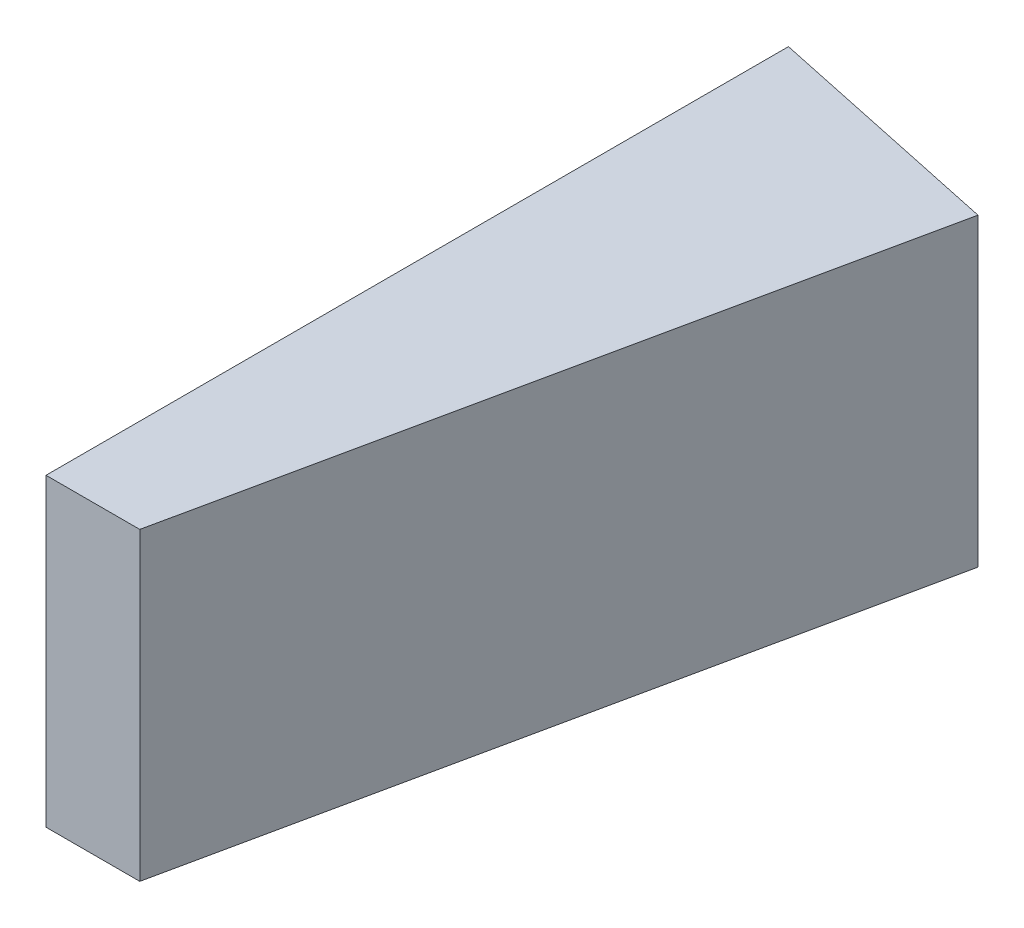
ISO-10303-21;
HEADER;
FILE_DESCRIPTION(('STEP AP214'),'2;1');
FILE_NAME('part.step','',(''),(''),'','','');
FILE_SCHEMA(('AUTOMOTIVE_DESIGN { 1 0 10303 214 1 1 1 1 }'));
ENDSEC;
DATA;
#1=APPLICATION_CONTEXT('core data for automotive mechanical design processes');
#2=APPLICATION_PROTOCOL_DEFINITION('international standard','automotive_design',2000,#1);
#3=PRODUCT_CONTEXT('',#1,'mechanical');
#4=PRODUCT('Part','Part','',(#3));
#5=PRODUCT_RELATED_PRODUCT_CATEGORY('part','',(#4));
#6=PRODUCT_DEFINITION_FORMATION('','',#4);
#7=PRODUCT_DEFINITION_CONTEXT('part definition',#1,'design');
#8=PRODUCT_DEFINITION('design','',#6,#7);
#9=PRODUCT_DEFINITION_SHAPE('','',#8);
#10=(LENGTH_UNIT() NAMED_UNIT(*) SI_UNIT(.MILLI.,.METRE.));
#11=(NAMED_UNIT(*) PLANE_ANGLE_UNIT() SI_UNIT($,.RADIAN.));
#12=(NAMED_UNIT(*) SI_UNIT($,.STERADIAN.) SOLID_ANGLE_UNIT());
#13=UNCERTAINTY_MEASURE_WITH_UNIT(LENGTH_MEASURE(1.E-05),#10,'distance_accuracy_value','');
#14=(GEOMETRIC_REPRESENTATION_CONTEXT(3) GLOBAL_UNCERTAINTY_ASSIGNED_CONTEXT((#13)) GLOBAL_UNIT_ASSIGNED_CONTEXT((#10,
#11,#12)) REPRESENTATION_CONTEXT('',''));
#15=CARTESIAN_POINT('',(0.,0.,0.));
#16=DIRECTION('',(0.,0.,1.));
#17=DIRECTION('',(1.,0.,0.));
#18=AXIS2_PLACEMENT_3D('',#15,#16,#17);
#19=CARTESIAN_POINT('',(0.,10.,0.));
#20=DIRECTION('',(0.,0.,-1.));
#21=DIRECTION('',(-1.,0.,0.));
#22=AXIS2_PLACEMENT_3D('',#19,#20,#21);
#23=PLANE('',#22);
#24=DIRECTION('',(1.,0.,0.));
#25=VECTOR('',#24,1.);
#26=CARTESIAN_POINT('',(0.,0.,0.));
#27=LINE('',#26,#25);
#28=CARTESIAN_POINT('',(0.,0.,0.));
#29=VERTEX_POINT('',#28);
#30=CARTESIAN_POINT('',(3.07711384910708,0.,0.));
#31=VERTEX_POINT('',#30);
#32=EDGE_CURVE('E96',#29,#31,#27,.T.);
#33=ORIENTED_EDGE('',*,*,#32,.T.);
#34=DIRECTION('',(0.,-1.,0.));
#35=VECTOR('',#34,1.);
#36=CARTESIAN_POINT('',(3.07711384910708,10.,0.));
#37=LINE('',#36,#35);
#38=CARTESIAN_POINT('',(3.07711384910708,10.,0.));
#39=VERTEX_POINT('',#38);
#40=EDGE_CURVE('E11',#39,#31,#37,.T.);
#41=ORIENTED_EDGE('',*,*,#40,.F.);
#42=DIRECTION('',(1.,0.,0.));
#43=VECTOR('',#42,1.);
#44=CARTESIAN_POINT('',(0.,10.,0.));
#45=LINE('',#44,#43);
#46=CARTESIAN_POINT('',(0.,10.,0.));
#47=VERTEX_POINT('',#46);
#48=EDGE_CURVE('E84',#47,#39,#45,.T.);
#49=ORIENTED_EDGE('',*,*,#48,.F.);
#50=DIRECTION('',(0.,-1.,0.));
#51=VECTOR('',#50,1.);
#52=CARTESIAN_POINT('',(0.,10.,0.));
#53=LINE('',#52,#51);
#54=EDGE_CURVE('E92',#47,#29,#53,.T.);
#55=ORIENTED_EDGE('',*,*,#54,.T.);
#56=EDGE_LOOP('',(#33,#41,#49,#55));
#57=FACE_BOUND('',#56,.T.);
#58=ADVANCED_FACE('F33',(#57),#23,.F.);
#59=CARTESIAN_POINT('',(3.07711384910708,10.,0.));
#60=DIRECTION('',(-0.978147600733806,0.,-0.207911690817756));
#61=DIRECTION('',(-0.207911690817756,0.,0.978147600733806));
#62=AXIS2_PLACEMENT_3D('',#59,#60,#61);
#63=PLANE('',#62);
#64=DIRECTION('',(0.207911690817756,0.,-0.978147600733806));
#65=VECTOR('',#64,1.);
#66=CARTESIAN_POINT('',(3.07711384910708,0.,0.));
#67=LINE('',#66,#65);
#68=CARTESIAN_POINT('',(7.89769135349926,0.,-22.6790340722384));
#69=VERTEX_POINT('',#68);
#70=EDGE_CURVE('E88',#31,#69,#67,.T.);
#71=ORIENTED_EDGE('',*,*,#70,.T.);
#72=DIRECTION('',(0.,-1.,0.));
#73=VECTOR('',#72,1.);
#74=CARTESIAN_POINT('',(7.89769135349926,10.,-22.6790340722384));
#75=LINE('',#74,#73);
#76=CARTESIAN_POINT('',(7.89769135349926,10.,-22.6790340722384));
#77=VERTEX_POINT('',#76);
#78=EDGE_CURVE('E41',#77,#69,#75,.T.);
#79=ORIENTED_EDGE('',*,*,#78,.F.);
#80=DIRECTION('',(0.207911690817756,0.,-0.978147600733806));
#81=VECTOR('',#80,1.);
#82=CARTESIAN_POINT('',(3.07711384910708,10.,0.));
#83=LINE('',#82,#81);
#84=EDGE_CURVE('E79',#39,#77,#83,.T.);
#85=ORIENTED_EDGE('',*,*,#84,.F.);
#86=ORIENTED_EDGE('',*,*,#40,.T.);
#87=EDGE_LOOP('',(#71,#79,#85,#86));
#88=FACE_BOUND('',#87,.T.);
#89=ADVANCED_FACE('F87',(#88),#63,.F.);
#90=CARTESIAN_POINT('',(0.,10.,-24.3577401914692));
#91=DIRECTION('',(-0.207911690817756,0.,0.978147600733806));
#92=DIRECTION('',(0.978147600733806,0.,0.207911690817756));
#93=AXIS2_PLACEMENT_3D('',#90,#91,#92);
#94=PLANE('',#93);
#95=DIRECTION('',(-0.978147600733806,0.,-0.207911690817756));
#96=VECTOR('',#95,1.);
#97=CARTESIAN_POINT('',(0.,0.,-24.3577401914692));
#98=LINE('',#97,#96);
#99=CARTESIAN_POINT('',(0.,0.,-24.3577401914692));
#100=VERTEX_POINT('',#99);
#101=EDGE_CURVE('E66',#69,#100,#98,.T.);
#102=ORIENTED_EDGE('',*,*,#101,.T.);
#103=DIRECTION('',(0.,-1.,0.));
#104=VECTOR('',#103,1.);
#105=CARTESIAN_POINT('',(0.,10.,-24.3577401914692));
#106=LINE('',#105,#104);
#107=CARTESIAN_POINT('',(0.,10.,-24.3577401914692));
#108=VERTEX_POINT('',#107);
#109=EDGE_CURVE('E89',#108,#100,#106,.T.);
#110=ORIENTED_EDGE('',*,*,#109,.F.);
#111=DIRECTION('',(-0.978147600733806,0.,-0.207911690817756));
#112=VECTOR('',#111,1.);
#113=CARTESIAN_POINT('',(0.,10.,-24.3577401914692));
#114=LINE('',#113,#112);
#115=EDGE_CURVE('E82',#77,#108,#114,.T.);
#116=ORIENTED_EDGE('',*,*,#115,.F.);
#117=ORIENTED_EDGE('',*,*,#78,.T.);
#118=EDGE_LOOP('',(#102,#110,#116,#117));
#119=FACE_BOUND('',#118,.T.);
#120=ADVANCED_FACE('F90',(#119),#94,.F.);
#121=CARTESIAN_POINT('',(0.,10.,0.));
#122=DIRECTION('',(1.,0.,0.));
#123=DIRECTION('',(0.,0.,-1.));
#124=AXIS2_PLACEMENT_3D('',#121,#122,#123);
#125=PLANE('',#124);
#126=DIRECTION('',(0.,0.,1.));
#127=VECTOR('',#126,1.);
#128=CARTESIAN_POINT('',(0.,0.,0.));
#129=LINE('',#128,#127);
#130=EDGE_CURVE('E72',#100,#29,#129,.T.);
#131=ORIENTED_EDGE('',*,*,#130,.T.);
#132=ORIENTED_EDGE('',*,*,#54,.F.);
#133=DIRECTION('',(0.,0.,1.));
#134=VECTOR('',#133,1.);
#135=CARTESIAN_POINT('',(0.,10.,0.));
#136=LINE('',#135,#134);
#137=EDGE_CURVE('E49',#108,#47,#136,.T.);
#138=ORIENTED_EDGE('',*,*,#137,.F.);
#139=ORIENTED_EDGE('',*,*,#109,.T.);
#140=EDGE_LOOP('',(#131,#132,#138,#139));
#141=FACE_BOUND('',#140,.T.);
#142=ADVANCED_FACE('F103',(#141),#125,.F.);
#143=CARTESIAN_POINT('',(0.,10.,0.));
#144=DIRECTION('',(0.,1.,0.));
#145=DIRECTION('',(0.,0.,1.));
#146=AXIS2_PLACEMENT_3D('',#143,#144,#145);
#147=PLANE('',#146);
#148=ORIENTED_EDGE('',*,*,#48,.T.);
#149=ORIENTED_EDGE('',*,*,#84,.T.);
#150=ORIENTED_EDGE('',*,*,#115,.T.);
#151=ORIENTED_EDGE('',*,*,#137,.T.);
#152=EDGE_LOOP('',(#148,#149,#150,#151));
#153=FACE_BOUND('',#152,.T.);
#154=ADVANCED_FACE('F80',(#153),#147,.T.);
#155=CARTESIAN_POINT('',(0.,0.,0.));
#156=DIRECTION('',(0.,1.,0.));
#157=DIRECTION('',(0.,0.,1.));
#158=AXIS2_PLACEMENT_3D('',#155,#156,#157);
#159=PLANE('',#158);
#160=ORIENTED_EDGE('',*,*,#32,.F.);
#161=ORIENTED_EDGE('',*,*,#130,.F.);
#162=ORIENTED_EDGE('',*,*,#101,.F.);
#163=ORIENTED_EDGE('',*,*,#70,.F.);
#164=EDGE_LOOP('',(#160,#161,#162,#163));
#165=FACE_BOUND('',#164,.T.);
#166=ADVANCED_FACE('F106',(#165),#159,.F.);
#167=CLOSED_SHELL('',(#58,#89,#120,#142,#154,#166));
#168=MANIFOLD_SOLID_BREP('B2',#167);
#169=ADVANCED_BREP_SHAPE_REPRESENTATION('',(#18,#168),#14);
#170=SHAPE_DEFINITION_REPRESENTATION(#9,#169);
ENDSEC;
END-ISO-10303-21;
